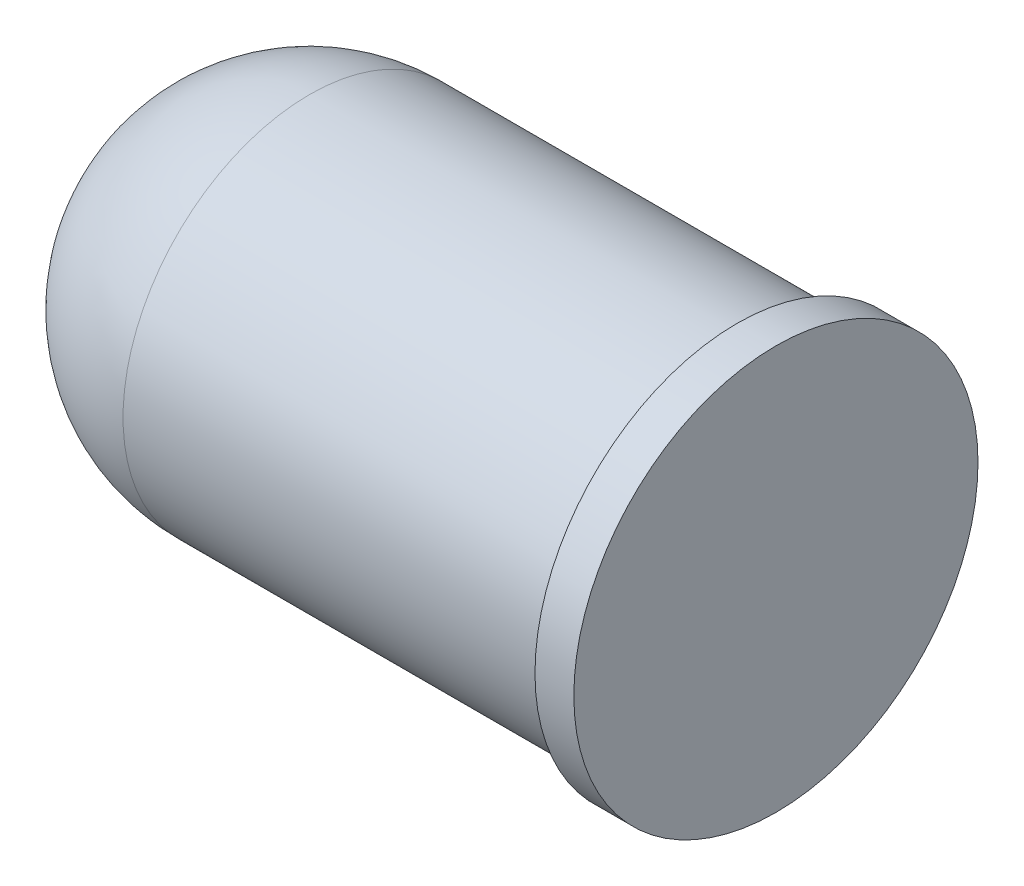
ISO-10303-21;
HEADER;
FILE_DESCRIPTION(('STEP AP214'),'2;1');
FILE_NAME('part.step','',(''),(''),'','','');
FILE_SCHEMA(('AUTOMOTIVE_DESIGN { 1 0 10303 214 1 1 1 1 }'));
ENDSEC;
DATA;
#1=APPLICATION_CONTEXT('core data for automotive mechanical design processes');
#2=APPLICATION_PROTOCOL_DEFINITION('international standard','automotive_design',2000,#1);
#3=PRODUCT_CONTEXT('',#1,'mechanical');
#4=PRODUCT('Part','Part','',(#3));
#5=PRODUCT_RELATED_PRODUCT_CATEGORY('part','',(#4));
#6=PRODUCT_DEFINITION_FORMATION('','',#4);
#7=PRODUCT_DEFINITION_CONTEXT('part definition',#1,'design');
#8=PRODUCT_DEFINITION('design','',#6,#7);
#9=PRODUCT_DEFINITION_SHAPE('','',#8);
#10=(LENGTH_UNIT() NAMED_UNIT(*) SI_UNIT(.MILLI.,.METRE.));
#11=(NAMED_UNIT(*) PLANE_ANGLE_UNIT() SI_UNIT($,.RADIAN.));
#12=(NAMED_UNIT(*) SI_UNIT($,.STERADIAN.) SOLID_ANGLE_UNIT());
#13=UNCERTAINTY_MEASURE_WITH_UNIT(LENGTH_MEASURE(1.E-05),#10,'distance_accuracy_value','');
#14=(GEOMETRIC_REPRESENTATION_CONTEXT(3) GLOBAL_UNCERTAINTY_ASSIGNED_CONTEXT((#13)) GLOBAL_UNIT_ASSIGNED_CONTEXT((#10,
#11,#12)) REPRESENTATION_CONTEXT('',''));
#15=CARTESIAN_POINT('',(0.,0.,0.));
#16=DIRECTION('',(0.,0.,1.));
#17=DIRECTION('',(1.,0.,0.));
#18=AXIS2_PLACEMENT_3D('',#15,#16,#17);
#19=CARTESIAN_POINT('',(0.,0.,0.));
#20=DIRECTION('',(-1.,0.,0.));
#21=DIRECTION('',(0.,-1.,0.));
#22=AXIS2_PLACEMENT_3D('',#19,#20,#21);
#23=PLANE('',#22);
#24=CARTESIAN_POINT('',(0.,0.,0.));
#25=DIRECTION('',(-1.,0.,0.));
#26=DIRECTION('',(0.,-1.,0.));
#27=AXIS2_PLACEMENT_3D('',#24,#25,#26);
#28=CIRCLE('',#27,2.6);
#29=CARTESIAN_POINT('',(0.,-2.6,0.));
#30=VERTEX_POINT('',#29);
#31=EDGE_CURVE('E48',#30,#30,#28,.T.);
#32=ORIENTED_EDGE('',*,*,#31,.F.);
#33=EDGE_LOOP('',(#32));
#34=FACE_BOUND('',#33,.T.);
#35=ADVANCED_FACE('F34',(#34),#23,.F.);
#36=CARTESIAN_POINT('',(-6.,0.,0.));
#37=DIRECTION('',(-1.,0.,0.));
#38=DIRECTION('',(0.,1.,0.));
#39=AXIS2_PLACEMENT_3D('',#36,#37,#38);
#40=SPHERICAL_SURFACE('',#39,2.4);
#41=CARTESIAN_POINT('',(-6.,0.,0.));
#42=DIRECTION('',(-1.,0.,0.));
#43=DIRECTION('',(0.,-1.,0.));
#44=AXIS2_PLACEMENT_3D('',#41,#42,#43);
#45=CIRCLE('',#44,2.4);
#46=CARTESIAN_POINT('',(-6.,-2.4,0.));
#47=VERTEX_POINT('',#46);
#48=EDGE_CURVE('E10',#47,#47,#45,.T.);
#49=ORIENTED_EDGE('',*,*,#48,.T.);
#50=EDGE_LOOP('',(#49));
#51=FACE_BOUND('',#50,.T.);
#52=ADVANCED_FACE('F57',(#51),#40,.T.);
#53=CARTESIAN_POINT('',(-6.7768053707067,0.,0.));
#54=DIRECTION('',(-1.,0.,0.));
#55=DIRECTION('',(0.,-1.,0.));
#56=AXIS2_PLACEMENT_3D('',#53,#54,#55);
#57=CYLINDRICAL_SURFACE('',#56,2.4);
#58=ORIENTED_EDGE('',*,*,#48,.F.);
#59=EDGE_LOOP('',(#58));
#60=FACE_BOUND('',#59,.T.);
#61=CARTESIAN_POINT('',(-0.5,0.,0.));
#62=DIRECTION('',(-1.,0.,0.));
#63=DIRECTION('',(0.,-1.,0.));
#64=AXIS2_PLACEMENT_3D('',#61,#62,#63);
#65=CIRCLE('',#64,2.4);
#66=CARTESIAN_POINT('',(-0.5,-2.4,0.));
#67=VERTEX_POINT('',#66);
#68=EDGE_CURVE('E40',#67,#67,#65,.T.);
#69=ORIENTED_EDGE('',*,*,#68,.T.);
#70=EDGE_LOOP('',(#69));
#71=FACE_BOUND('',#70,.T.);
#72=ADVANCED_FACE('F61',(#60,#71),#57,.T.);
#73=CARTESIAN_POINT('',(-0.5,2.4,0.));
#74=DIRECTION('',(1.,0.,0.));
#75=DIRECTION('',(0.,1.,0.));
#76=AXIS2_PLACEMENT_3D('',#73,#74,#75);
#77=PLANE('',#76);
#78=ORIENTED_EDGE('',*,*,#68,.F.);
#79=EDGE_LOOP('',(#78));
#80=FACE_BOUND('',#79,.T.);
#81=CARTESIAN_POINT('',(-0.5,0.,0.));
#82=DIRECTION('',(-1.,0.,0.));
#83=DIRECTION('',(0.,-1.,0.));
#84=AXIS2_PLACEMENT_3D('',#81,#82,#83);
#85=CIRCLE('',#84,2.6);
#86=CARTESIAN_POINT('',(-0.5,-2.6,0.));
#87=VERTEX_POINT('',#86);
#88=EDGE_CURVE('E44',#87,#87,#85,.T.);
#89=ORIENTED_EDGE('',*,*,#88,.T.);
#90=EDGE_LOOP('',(#89));
#91=FACE_BOUND('',#90,.T.);
#92=ADVANCED_FACE('F65',(#80,#91),#77,.F.);
#93=CARTESIAN_POINT('',(-6.7768053707067,0.,0.));
#94=DIRECTION('',(-1.,0.,0.));
#95=DIRECTION('',(0.,-1.,0.));
#96=AXIS2_PLACEMENT_3D('',#93,#94,#95);
#97=CYLINDRICAL_SURFACE('',#96,2.6);
#98=ORIENTED_EDGE('',*,*,#88,.F.);
#99=EDGE_LOOP('',(#98));
#100=FACE_BOUND('',#99,.T.);
#101=ORIENTED_EDGE('',*,*,#31,.T.);
#102=EDGE_LOOP('',(#101));
#103=FACE_BOUND('',#102,.T.);
#104=ADVANCED_FACE('F54',(#100,#103),#97,.T.);
#105=CLOSED_SHELL('',(#35,#52,#72,#92,#104));
#106=MANIFOLD_SOLID_BREP('B2',#105);
#107=ADVANCED_BREP_SHAPE_REPRESENTATION('',(#18,#106),#14);
#108=SHAPE_DEFINITION_REPRESENTATION(#9,#107);
ENDSEC;
END-ISO-10303-21;
